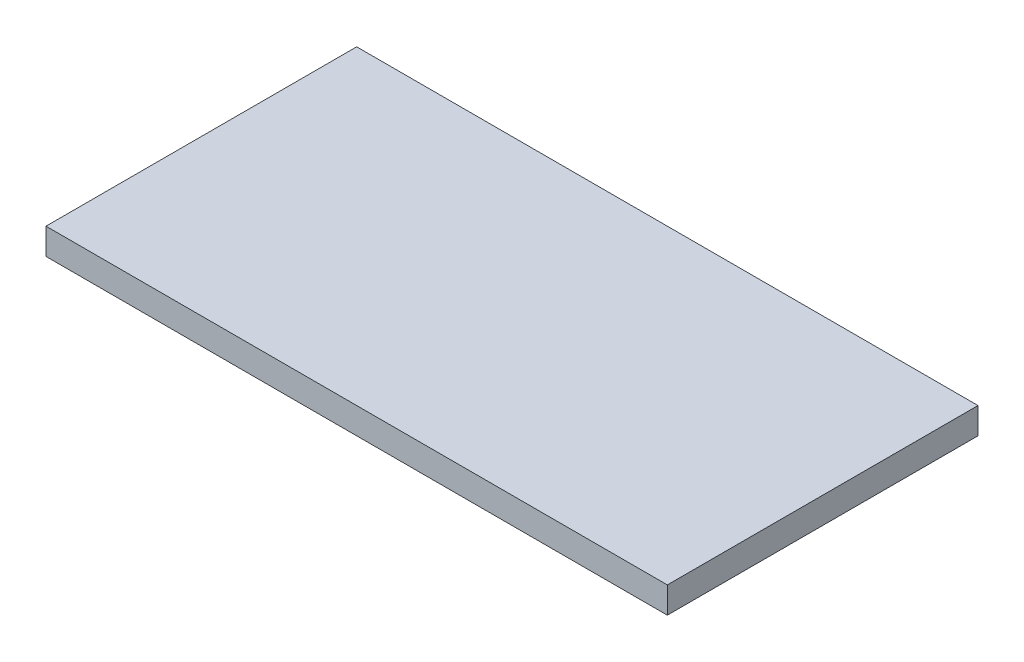
ISO-10303-21;
HEADER;
FILE_DESCRIPTION(('STEP AP214'),'2;1');
FILE_NAME('part.step','',(''),(''),'','','');
FILE_SCHEMA(('AUTOMOTIVE_DESIGN { 1 0 10303 214 1 1 1 1 }'));
ENDSEC;
DATA;
#1=APPLICATION_CONTEXT('core data for automotive mechanical design processes');
#2=APPLICATION_PROTOCOL_DEFINITION('international standard','automotive_design',2000,#1);
#3=PRODUCT_CONTEXT('',#1,'mechanical');
#4=PRODUCT('Part','Part','',(#3));
#5=PRODUCT_RELATED_PRODUCT_CATEGORY('part','',(#4));
#6=PRODUCT_DEFINITION_FORMATION('','',#4);
#7=PRODUCT_DEFINITION_CONTEXT('part definition',#1,'design');
#8=PRODUCT_DEFINITION('design','',#6,#7);
#9=PRODUCT_DEFINITION_SHAPE('','',#8);
#10=(LENGTH_UNIT() NAMED_UNIT(*) SI_UNIT(.MILLI.,.METRE.));
#11=(NAMED_UNIT(*) PLANE_ANGLE_UNIT() SI_UNIT($,.RADIAN.));
#12=(NAMED_UNIT(*) SI_UNIT($,.STERADIAN.) SOLID_ANGLE_UNIT());
#13=UNCERTAINTY_MEASURE_WITH_UNIT(LENGTH_MEASURE(1.E-05),#10,'distance_accuracy_value','');
#14=(GEOMETRIC_REPRESENTATION_CONTEXT(3) GLOBAL_UNCERTAINTY_ASSIGNED_CONTEXT((#13)) GLOBAL_UNIT_ASSIGNED_CONTEXT((#10,
#11,#12)) REPRESENTATION_CONTEXT('',''));
#15=CARTESIAN_POINT('',(0.,0.,0.));
#16=DIRECTION('',(0.,0.,1.));
#17=DIRECTION('',(1.,0.,0.));
#18=AXIS2_PLACEMENT_3D('',#15,#16,#17);
#19=CARTESIAN_POINT('',(-50.9,4.3,-25.45));
#20=DIRECTION('',(1.,0.,0.));
#21=DIRECTION('',(0.,0.,-1.));
#22=AXIS2_PLACEMENT_3D('',#19,#20,#21);
#23=PLANE('',#22);
#24=DIRECTION('',(0.,0.,1.));
#25=VECTOR('',#24,1.);
#26=CARTESIAN_POINT('',(-50.9,0.,-25.45));
#27=LINE('',#26,#25);
#28=CARTESIAN_POINT('',(-50.9,0.,-25.45));
#29=VERTEX_POINT('',#28);
#30=CARTESIAN_POINT('',(-50.9,0.,25.45));
#31=VERTEX_POINT('',#30);
#32=EDGE_CURVE('E107',#29,#31,#27,.T.);
#33=ORIENTED_EDGE('',*,*,#32,.T.);
#34=DIRECTION('',(0.,-1.,0.));
#35=VECTOR('',#34,1.);
#36=CARTESIAN_POINT('',(-50.9,4.3,25.45));
#37=LINE('',#36,#35);
#38=CARTESIAN_POINT('',(-50.9,4.3,25.45));
#39=VERTEX_POINT('',#38);
#40=EDGE_CURVE('E11',#39,#31,#37,.T.);
#41=ORIENTED_EDGE('',*,*,#40,.F.);
#42=DIRECTION('',(0.,0.,1.));
#43=VECTOR('',#42,1.);
#44=CARTESIAN_POINT('',(-50.9,4.3,-25.45));
#45=LINE('',#44,#43);
#46=CARTESIAN_POINT('',(-50.9,4.3,-25.45));
#47=VERTEX_POINT('',#46);
#48=EDGE_CURVE('E91',#47,#39,#45,.T.);
#49=ORIENTED_EDGE('',*,*,#48,.F.);
#50=DIRECTION('',(0.,-1.,0.));
#51=VECTOR('',#50,1.);
#52=CARTESIAN_POINT('',(-50.9,4.3,-25.45));
#53=LINE('',#52,#51);
#54=EDGE_CURVE('E103',#47,#29,#53,.T.);
#55=ORIENTED_EDGE('',*,*,#54,.T.);
#56=EDGE_LOOP('',(#33,#41,#49,#55));
#57=FACE_BOUND('',#56,.T.);
#58=ADVANCED_FACE('F39',(#57),#23,.F.);
#59=CARTESIAN_POINT('',(-50.9,4.3,25.45));
#60=DIRECTION('',(0.,0.,-1.));
#61=DIRECTION('',(-1.,0.,0.));
#62=AXIS2_PLACEMENT_3D('',#59,#60,#61);
#63=PLANE('',#62);
#64=DIRECTION('',(1.,0.,0.));
#65=VECTOR('',#64,1.);
#66=CARTESIAN_POINT('',(-50.9,0.,25.45));
#67=LINE('',#66,#65);
#68=CARTESIAN_POINT('',(50.9,0.,25.45));
#69=VERTEX_POINT('',#68);
#70=EDGE_CURVE('E96',#31,#69,#67,.T.);
#71=ORIENTED_EDGE('',*,*,#70,.T.);
#72=DIRECTION('',(0.,-1.,0.));
#73=VECTOR('',#72,1.);
#74=CARTESIAN_POINT('',(50.9,4.3,25.45));
#75=LINE('',#74,#73);
#76=CARTESIAN_POINT('',(50.9,4.3,25.45));
#77=VERTEX_POINT('',#76);
#78=EDGE_CURVE('E48',#77,#69,#75,.T.);
#79=ORIENTED_EDGE('',*,*,#78,.F.);
#80=DIRECTION('',(1.,0.,0.));
#81=VECTOR('',#80,1.);
#82=CARTESIAN_POINT('',(-50.9,4.3,25.45));
#83=LINE('',#82,#81);
#84=EDGE_CURVE('E86',#39,#77,#83,.T.);
#85=ORIENTED_EDGE('',*,*,#84,.F.);
#86=ORIENTED_EDGE('',*,*,#40,.T.);
#87=EDGE_LOOP('',(#71,#79,#85,#86));
#88=FACE_BOUND('',#87,.T.);
#89=ADVANCED_FACE('F95',(#88),#63,.F.);
#90=CARTESIAN_POINT('',(50.9,4.3,-25.45));
#91=DIRECTION('',(-1.,0.,0.));
#92=DIRECTION('',(0.,0.,1.));
#93=AXIS2_PLACEMENT_3D('',#90,#91,#92);
#94=PLANE('',#93);
#95=DIRECTION('',(0.,0.,-1.));
#96=VECTOR('',#95,1.);
#97=CARTESIAN_POINT('',(50.9,0.,-25.45));
#98=LINE('',#97,#96);
#99=CARTESIAN_POINT('',(50.9,0.,-25.45));
#100=VERTEX_POINT('',#99);
#101=EDGE_CURVE('E73',#69,#100,#98,.T.);
#102=ORIENTED_EDGE('',*,*,#101,.T.);
#103=DIRECTION('',(0.,-1.,0.));
#104=VECTOR('',#103,1.);
#105=CARTESIAN_POINT('',(50.9,4.3,-25.45));
#106=LINE('',#105,#104);
#107=CARTESIAN_POINT('',(50.9,4.3,-25.45));
#108=VERTEX_POINT('',#107);
#109=EDGE_CURVE('E98',#108,#100,#106,.T.);
#110=ORIENTED_EDGE('',*,*,#109,.F.);
#111=DIRECTION('',(0.,0.,-1.));
#112=VECTOR('',#111,1.);
#113=CARTESIAN_POINT('',(50.9,4.3,-25.45));
#114=LINE('',#113,#112);
#115=EDGE_CURVE('E89',#77,#108,#114,.T.);
#116=ORIENTED_EDGE('',*,*,#115,.F.);
#117=ORIENTED_EDGE('',*,*,#78,.T.);
#118=EDGE_LOOP('',(#102,#110,#116,#117));
#119=FACE_BOUND('',#118,.T.);
#120=ADVANCED_FACE('F99',(#119),#94,.F.);
#121=CARTESIAN_POINT('',(-50.9,4.3,-25.45));
#122=DIRECTION('',(0.,0.,1.));
#123=DIRECTION('',(1.,0.,0.));
#124=AXIS2_PLACEMENT_3D('',#121,#122,#123);
#125=PLANE('',#124);
#126=DIRECTION('',(-1.,0.,0.));
#127=VECTOR('',#126,1.);
#128=CARTESIAN_POINT('',(-50.9,0.,-25.45));
#129=LINE('',#128,#127);
#130=EDGE_CURVE('E79',#100,#29,#129,.T.);
#131=ORIENTED_EDGE('',*,*,#130,.T.);
#132=ORIENTED_EDGE('',*,*,#54,.F.);
#133=DIRECTION('',(-1.,0.,0.));
#134=VECTOR('',#133,1.);
#135=CARTESIAN_POINT('',(-50.9,4.3,-25.45));
#136=LINE('',#135,#134);
#137=EDGE_CURVE('E56',#108,#47,#136,.T.);
#138=ORIENTED_EDGE('',*,*,#137,.F.);
#139=ORIENTED_EDGE('',*,*,#109,.T.);
#140=EDGE_LOOP('',(#131,#132,#138,#139));
#141=FACE_BOUND('',#140,.T.);
#142=ADVANCED_FACE('F120',(#141),#125,.F.);
#143=CARTESIAN_POINT('',(0.,4.3,0.));
#144=DIRECTION('',(0.,1.,0.));
#145=DIRECTION('',(0.,0.,1.));
#146=AXIS2_PLACEMENT_3D('',#143,#144,#145);
#147=PLANE('',#146);
#148=ORIENTED_EDGE('',*,*,#48,.T.);
#149=ORIENTED_EDGE('',*,*,#84,.T.);
#150=ORIENTED_EDGE('',*,*,#115,.T.);
#151=ORIENTED_EDGE('',*,*,#137,.T.);
#152=EDGE_LOOP('',(#148,#149,#150,#151));
#153=FACE_BOUND('',#152,.T.);
#154=ADVANCED_FACE('F87',(#153),#147,.T.);
#155=CARTESIAN_POINT('',(0.,0.,0.));
#156=DIRECTION('',(0.,1.,0.));
#157=DIRECTION('',(0.,0.,1.));
#158=AXIS2_PLACEMENT_3D('',#155,#156,#157);
#159=PLANE('',#158);
#160=ORIENTED_EDGE('',*,*,#32,.F.);
#161=ORIENTED_EDGE('',*,*,#130,.F.);
#162=ORIENTED_EDGE('',*,*,#101,.F.);
#163=ORIENTED_EDGE('',*,*,#70,.F.);
#164=EDGE_LOOP('',(#160,#161,#162,#163));
#165=FACE_BOUND('',#164,.T.);
#166=ADVANCED_FACE('F123',(#165),#159,.F.);
#167=CLOSED_SHELL('',(#58,#89,#120,#142,#154,#166));
#168=MANIFOLD_SOLID_BREP('B2',#167);
#169=ADVANCED_BREP_SHAPE_REPRESENTATION('',(#18,#168),#14);
#170=SHAPE_DEFINITION_REPRESENTATION(#9,#169);
ENDSEC;
END-ISO-10303-21;
